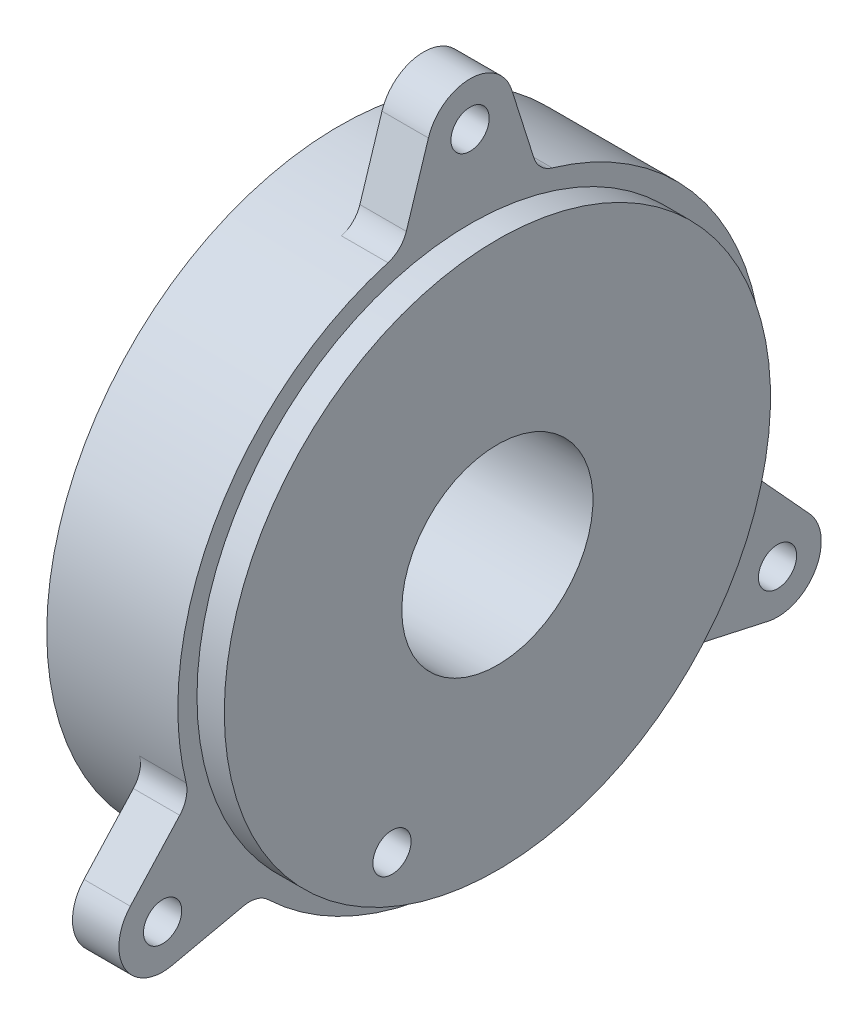
ISO-10303-21;
HEADER;
FILE_DESCRIPTION(('STEP AP214'),'2;1');
FILE_NAME('part.step','',(''),(''),'','','');
FILE_SCHEMA(('AUTOMOTIVE_DESIGN { 1 0 10303 214 1 1 1 1 }'));
ENDSEC;
DATA;
#1=APPLICATION_CONTEXT('core data for automotive mechanical design processes');
#2=APPLICATION_PROTOCOL_DEFINITION('international standard','automotive_design',2000,#1);
#3=PRODUCT_CONTEXT('',#1,'mechanical');
#4=PRODUCT('Part','Part','',(#3));
#5=PRODUCT_RELATED_PRODUCT_CATEGORY('part','',(#4));
#6=PRODUCT_DEFINITION_FORMATION('','',#4);
#7=PRODUCT_DEFINITION_CONTEXT('part definition',#1,'design');
#8=PRODUCT_DEFINITION('design','',#6,#7);
#9=PRODUCT_DEFINITION_SHAPE('','',#8);
#10=(LENGTH_UNIT() NAMED_UNIT(*) SI_UNIT(.MILLI.,.METRE.));
#11=(NAMED_UNIT(*) PLANE_ANGLE_UNIT() SI_UNIT($,.RADIAN.));
#12=(NAMED_UNIT(*) SI_UNIT($,.STERADIAN.) SOLID_ANGLE_UNIT());
#13=UNCERTAINTY_MEASURE_WITH_UNIT(LENGTH_MEASURE(1.E-05),#10,'distance_accuracy_value','');
#14=(GEOMETRIC_REPRESENTATION_CONTEXT(3) GLOBAL_UNCERTAINTY_ASSIGNED_CONTEXT((#13)) GLOBAL_UNIT_ASSIGNED_CONTEXT((#10,
#11,#12)) REPRESENTATION_CONTEXT('',''));
#15=CARTESIAN_POINT('',(0.,0.,0.));
#16=DIRECTION('',(0.,0.,1.));
#17=DIRECTION('',(1.,0.,0.));
#18=AXIS2_PLACEMENT_3D('',#15,#16,#17);
#19=CARTESIAN_POINT('',(0.,53.5,0.));
#20=DIRECTION('',(1.,0.,0.));
#21=DIRECTION('',(0.,0.,-1.));
#22=AXIS2_PLACEMENT_3D('',#19,#20,#21);
#23=PLANE('',#22);
#24=CARTESIAN_POINT('',(0.,0.,0.));
#25=DIRECTION('',(-1.,0.,0.));
#26=DIRECTION('',(0.,0.,1.));
#27=AXIS2_PLACEMENT_3D('',#24,#25,#26);
#28=CIRCLE('',#27,17.5);
#29=CARTESIAN_POINT('',(0.,0.,17.5));
#30=VERTEX_POINT('',#29);
#31=EDGE_CURVE('E270',#30,#30,#28,.T.);
#32=ORIENTED_EDGE('',*,*,#31,.F.);
#33=EDGE_LOOP('',(#32));
#34=FACE_BOUND('',#33,.T.);
#35=CARTESIAN_POINT('',(0.,0.,0.));
#36=DIRECTION('',(-1.,0.,0.));
#37=DIRECTION('',(0.,0.,1.));
#38=AXIS2_PLACEMENT_3D('',#35,#36,#37);
#39=CIRCLE('',#38,22.5);
#40=CARTESIAN_POINT('',(0.,0.,22.5));
#41=VERTEX_POINT('',#40);
#42=EDGE_CURVE('E436',#41,#41,#39,.T.);
#43=ORIENTED_EDGE('',*,*,#42,.T.);
#44=EDGE_LOOP('',(#43));
#45=FACE_BOUND('',#44,.T.);
#46=ADVANCED_FACE('F34',(#34,#45),#23,.F.);
#47=CARTESIAN_POINT('',(0.,0.,0.));
#48=DIRECTION('',(-1.,0.,0.));
#49=DIRECTION('',(0.,0.,1.));
#50=AXIS2_PLACEMENT_3D('',#47,#48,#49);
#51=CYLINDRICAL_SURFACE('',#50,53.5);
#52=CARTESIAN_POINT('',(0.,0.,0.));
#53=DIRECTION('',(-1.,0.,0.));
#54=DIRECTION('',(0.,0.,1.));
#55=AXIS2_PLACEMENT_3D('',#52,#53,#54);
#56=CIRCLE('',#55,53.5);
#57=CARTESIAN_POINT('',(0.,0.,53.5));
#58=VERTEX_POINT('',#57);
#59=EDGE_CURVE('E251',#58,#58,#56,.T.);
#60=ORIENTED_EDGE('',*,*,#59,.F.);
#61=EDGE_LOOP('',(#60));
#62=FACE_BOUND('',#61,.T.);
#63=CARTESIAN_POINT('',(24.,0.,0.));
#64=DIRECTION('',(-1.,0.,0.));
#65=DIRECTION('',(0.,0.,1.));
#66=AXIS2_PLACEMENT_3D('',#63,#64,#65);
#67=CIRCLE('',#66,53.5);
#68=CARTESIAN_POINT('',(24.,-38.6921063220218,-36.9482192854454));
#69=VERTEX_POINT('',#68);
#70=CARTESIAN_POINT('',(24.,-38.6920986751495,36.9482272932342));
#71=VERTEX_POINT('',#70);
#72=EDGE_CURVE('E261',#69,#71,#67,.T.);
#73=ORIENTED_EDGE('',*,*,#72,.T.);
#74=DIRECTION('',(-1.,0.,0.));
#75=VECTOR('',#74,1.);
#76=CARTESIAN_POINT('',(0.,-38.6920986751495,36.9482272932342));
#77=LINE('',#76,#75);
#78=CARTESIAN_POINT('',(15.5,-38.6920986751495,36.9482272932342));
#79=VERTEX_POINT('',#78);
#80=EDGE_CURVE('E320',#71,#79,#77,.T.);
#81=ORIENTED_EDGE('',*,*,#80,.T.);
#82=CARTESIAN_POINT('',(15.5,0.,0.));
#83=DIRECTION('',(1.,0.,0.));
#84=DIRECTION('',(0.,0.866025403784443,0.499999999999992));
#85=AXIS2_PLACEMENT_3D('',#82,#83,#84);
#86=CIRCLE('',#85,53.5);
#87=CARTESIAN_POINT('',(15.5,-12.6520433647827,51.9824566435221));
#88=VERTEX_POINT('',#87);
#89=EDGE_CURVE('E166',#79,#88,#86,.F.);
#90=ORIENTED_EDGE('',*,*,#89,.T.);
#91=DIRECTION('',(-1.,0.,0.));
#92=VECTOR('',#91,1.);
#93=CARTESIAN_POINT('',(0.,-12.6520433647827,51.9824566435221));
#94=LINE('',#93,#92);
#95=CARTESIAN_POINT('',(24.,-12.6520433647827,51.9824566435221));
#96=VERTEX_POINT('',#95);
#97=EDGE_CURVE('E317',#88,#96,#94,.F.);
#98=ORIENTED_EDGE('',*,*,#97,.T.);
#99=CARTESIAN_POINT('',(24.,51.3441527983169,15.0342267317971));
#100=VERTEX_POINT('',#99);
#101=EDGE_CURVE('E256',#96,#100,#67,.T.);
#102=ORIENTED_EDGE('',*,*,#101,.T.);
#103=DIRECTION('',(-1.,0.,0.));
#104=VECTOR('',#103,1.);
#105=CARTESIAN_POINT('',(0.,51.3441527983169,15.0342267317971));
#106=LINE('',#105,#104);
#107=CARTESIAN_POINT('',(15.5,51.3441527983169,15.0342267317971));
#108=VERTEX_POINT('',#107);
#109=EDGE_CURVE('E279',#100,#108,#106,.T.);
#110=ORIENTED_EDGE('',*,*,#109,.T.);
#111=CARTESIAN_POINT('',(15.5,0.,0.));
#112=DIRECTION('',(1.,0.,0.));
#113=DIRECTION('',(0.,0.,-1.));
#114=AXIS2_PLACEMENT_3D('',#111,#112,#113);
#115=CIRCLE('',#114,53.5);
#116=CARTESIAN_POINT('',(15.5,51.3441496868048,-15.0342373580764));
#117=VERTEX_POINT('',#116);
#118=EDGE_CURVE('E228',#108,#117,#115,.F.);
#119=ORIENTED_EDGE('',*,*,#118,.T.);
#120=DIRECTION('',(-1.,0.,0.));
#121=VECTOR('',#120,1.);
#122=CARTESIAN_POINT('',(0.,51.3441496868048,-15.0342373580764));
#123=LINE('',#122,#121);
#124=CARTESIAN_POINT('',(24.,51.3441496868048,-15.0342373580764));
#125=VERTEX_POINT('',#124);
#126=EDGE_CURVE('E276',#117,#125,#123,.F.);
#127=ORIENTED_EDGE('',*,*,#126,.T.);
#128=CARTESIAN_POINT('',(24.,-12.6520541231673,-51.9824540250308));
#129=VERTEX_POINT('',#128);
#130=EDGE_CURVE('E257',#125,#129,#67,.T.);
#131=ORIENTED_EDGE('',*,*,#130,.T.);
#132=DIRECTION('',(-1.,0.,0.));
#133=VECTOR('',#132,1.);
#134=CARTESIAN_POINT('',(0.,-12.6520541231673,-51.9824540250308));
#135=LINE('',#134,#133);
#136=CARTESIAN_POINT('',(15.5,-12.6520541231673,-51.9824540250308));
#137=VERTEX_POINT('',#136);
#138=EDGE_CURVE('E300',#129,#137,#135,.T.);
#139=ORIENTED_EDGE('',*,*,#138,.T.);
#140=CARTESIAN_POINT('',(15.5,0.,0.));
#141=DIRECTION('',(1.,0.,0.));
#142=DIRECTION('',(0.,-0.866025403784436,0.500000000000004));
#143=AXIS2_PLACEMENT_3D('',#140,#141,#142);
#144=CIRCLE('',#143,53.5);
#145=CARTESIAN_POINT('',(15.5,-38.6921063220218,-36.9482192854454));
#146=VERTEX_POINT('',#145);
#147=EDGE_CURVE('E200',#137,#146,#144,.F.);
#148=ORIENTED_EDGE('',*,*,#147,.T.);
#149=DIRECTION('',(-1.,0.,0.));
#150=VECTOR('',#149,1.);
#151=CARTESIAN_POINT('',(0.,-38.6921063220218,-36.9482192854454));
#152=LINE('',#151,#150);
#153=EDGE_CURVE('E297',#146,#69,#152,.F.);
#154=ORIENTED_EDGE('',*,*,#153,.T.);
#155=EDGE_LOOP('',(#73,#81,#90,#98,#102,#110,#119,#127,#131,#139,#148,#154));
#156=FACE_BOUND('',#155,.T.);
#157=ADVANCED_FACE('F343',(#62,#156),#51,.T.);
#158=CARTESIAN_POINT('',(0.,0.,0.));
#159=DIRECTION('',(-1.,0.,0.));
#160=DIRECTION('',(0.,0.,1.));
#161=AXIS2_PLACEMENT_3D('',#158,#159,#160);
#162=CIRCLE('',#161,48.5);
#163=CARTESIAN_POINT('',(0.,0.,48.5));
#164=VERTEX_POINT('',#163);
#165=EDGE_CURVE('E432',#164,#164,#162,.T.);
#166=ORIENTED_EDGE('',*,*,#165,.F.);
#167=EDGE_LOOP('',(#166));
#168=FACE_BOUND('',#167,.T.);
#169=ORIENTED_EDGE('',*,*,#59,.T.);
#170=EDGE_LOOP('',(#169));
#171=FACE_BOUND('',#170,.T.);
#172=ADVANCED_FACE('F411',(#168,#171),#23,.F.);
#173=CARTESIAN_POINT('',(0.,0.,0.));
#174=DIRECTION('',(-1.,0.,0.));
#175=DIRECTION('',(0.,0.,1.));
#176=AXIS2_PLACEMENT_3D('',#173,#174,#175);
#177=CYLINDRICAL_SURFACE('',#176,17.5);
#178=CARTESIAN_POINT('',(29.,0.,0.));
#179=DIRECTION('',(-1.,0.,0.));
#180=DIRECTION('',(0.,0.,1.));
#181=AXIS2_PLACEMENT_3D('',#178,#179,#180);
#182=CIRCLE('',#181,17.5);
#183=CARTESIAN_POINT('',(29.,0.,17.5));
#184=VERTEX_POINT('',#183);
#185=EDGE_CURVE('E267',#184,#184,#182,.T.);
#186=ORIENTED_EDGE('',*,*,#185,.F.);
#187=EDGE_LOOP('',(#186));
#188=FACE_BOUND('',#187,.T.);
#189=ORIENTED_EDGE('',*,*,#31,.T.);
#190=EDGE_LOOP('',(#189));
#191=FACE_BOUND('',#190,.T.);
#192=ADVANCED_FACE('F422',(#188,#191),#177,.F.);
#193=CARTESIAN_POINT('',(29.,17.5,0.));
#194=DIRECTION('',(-1.,0.,0.));
#195=DIRECTION('',(0.,0.,1.));
#196=AXIS2_PLACEMENT_3D('',#193,#194,#195);
#197=PLANE('',#196);
#198=CARTESIAN_POINT('',(29.,-37.500020500125,19.2916394102308));
#199=DIRECTION('',(1.,0.,0.));
#200=DIRECTION('',(0.,0.,-1.));
#201=AXIS2_PLACEMENT_3D('',#198,#199,#200);
#202=CIRCLE('',#201,3.5);
#203=CARTESIAN_POINT('',(29.,-37.500020500125,15.7916394102308));
#204=VERTEX_POINT('',#203);
#205=EDGE_CURVE('E493',#204,#204,#202,.T.);
#206=ORIENTED_EDGE('',*,*,#205,.F.);
#207=EDGE_LOOP('',(#206));
#208=FACE_BOUND('',#207,.T.);
#209=CARTESIAN_POINT('',(29.,0.,0.));
#210=DIRECTION('',(-1.,0.,0.));
#211=DIRECTION('',(0.,0.,1.));
#212=AXIS2_PLACEMENT_3D('',#209,#210,#211);
#213=CIRCLE('',#212,50.);
#214=CARTESIAN_POINT('',(29.,0.,50.));
#215=VERTEX_POINT('',#214);
#216=EDGE_CURVE('E264',#215,#215,#213,.T.);
#217=ORIENTED_EDGE('',*,*,#216,.F.);
#218=EDGE_LOOP('',(#217));
#219=FACE_BOUND('',#218,.T.);
#220=ORIENTED_EDGE('',*,*,#185,.T.);
#221=EDGE_LOOP('',(#220));
#222=FACE_BOUND('',#221,.T.);
#223=ADVANCED_FACE('F427',(#208,#219,#222),#197,.F.);
#224=CARTESIAN_POINT('',(0.,0.,0.));
#225=DIRECTION('',(-1.,0.,0.));
#226=DIRECTION('',(0.,0.,1.));
#227=AXIS2_PLACEMENT_3D('',#224,#225,#226);
#228=CYLINDRICAL_SURFACE('',#227,50.);
#229=CARTESIAN_POINT('',(24.,0.,0.));
#230=DIRECTION('',(-1.,0.,0.));
#231=DIRECTION('',(0.,0.,1.));
#232=AXIS2_PLACEMENT_3D('',#229,#230,#231);
#233=CIRCLE('',#232,50.);
#234=CARTESIAN_POINT('',(24.,0.,50.));
#235=VERTEX_POINT('',#234);
#236=EDGE_CURVE('E260',#235,#235,#233,.T.);
#237=ORIENTED_EDGE('',*,*,#236,.F.);
#238=EDGE_LOOP('',(#237));
#239=FACE_BOUND('',#238,.T.);
#240=ORIENTED_EDGE('',*,*,#216,.T.);
#241=EDGE_LOOP('',(#240));
#242=FACE_BOUND('',#241,.T.);
#243=ADVANCED_FACE('F482',(#239,#242),#228,.T.);
#244=CARTESIAN_POINT('',(24.,50.,0.));
#245=DIRECTION('',(-1.,0.,0.));
#246=DIRECTION('',(0.,0.,1.));
#247=AXIS2_PLACEMENT_3D('',#244,#245,#246);
#248=PLANE('',#247);
#249=ORIENTED_EDGE('',*,*,#130,.F.);
#250=CARTESIAN_POINT('',(24.,56.142668349123,-16.4393062700462));
#251=DIRECTION('',(-1.,0.,0.));
#252=DIRECTION('',(0.,0.,1.));
#253=AXIS2_PLACEMENT_3D('',#250,#251,#252);
#254=CIRCLE('',#253,5.);
#255=CARTESIAN_POINT('',(24.,54.6337956457435,-11.6724096732029));
#256=VERTEX_POINT('',#255);
#257=EDGE_CURVE('E289',#125,#256,#254,.T.);
#258=ORIENTED_EDGE('',*,*,#257,.T.);
#259=DIRECTION('',(0.,0.95337931936866,0.301774540675901));
#260=VECTOR('',#259,1.);
#261=CARTESIAN_POINT('',(24.,-25.4193345788429,-37.01174325471));
#262=LINE('',#261,#260);
#263=CARTESIAN_POINT('',(24.,67.4141963254029,-7.6270108834408));
#264=VERTEX_POINT('',#263);
#265=EDGE_CURVE('E241',#256,#264,#262,.T.);
#266=ORIENTED_EDGE('',*,*,#265,.T.);
#267=CARTESIAN_POINT('',(24.,64.9999999999957,2.3671508478715E-05));
#268=DIRECTION('',(1.,0.,0.));
#269=DIRECTION('',(0.,0.,-1.));
#270=AXIS2_PLACEMENT_3D('',#267,#268,#269);
#271=CIRCLE('',#270,8.00000000000001);
#272=CARTESIAN_POINT('',(24.,67.414164926528,7.62706816511811));
#273=VERTEX_POINT('',#272);
#274=EDGE_CURVE('E243',#264,#273,#271,.T.);
#275=ORIENTED_EDGE('',*,*,#274,.T.);
#276=DIRECTION('',(0.,0.953380561701207,-0.301770615816537));
#277=VECTOR('',#276,1.);
#278=CARTESIAN_POINT('',(24.,42.6797575184133,15.4561740387316));
#279=LINE('',#278,#277);
#280=CARTESIAN_POINT('',(24.,54.633818672348,11.6723918421506));
#281=VERTEX_POINT('',#280);
#282=EDGE_CURVE('E223',#281,#273,#279,.T.);
#283=ORIENTED_EDGE('',*,*,#282,.F.);
#284=CARTESIAN_POINT('',(24.,56.1426717514307,16.4392946506567));
#285=DIRECTION('',(-1.,0.,0.));
#286=DIRECTION('',(0.,0.,1.));
#287=AXIS2_PLACEMENT_3D('',#284,#285,#286);
#288=CIRCLE('',#287,5.);
#289=EDGE_CURVE('E284',#281,#100,#288,.T.);
#290=ORIENTED_EDGE('',*,*,#289,.T.);
#291=ORIENTED_EDGE('',*,*,#101,.F.);
#292=CARTESIAN_POINT('',(24.,-13.8344773241082,56.8406301616083));
#293=DIRECTION('',(-1.,0.,0.));
#294=DIRECTION('',(0.,0.,1.));
#295=AXIS2_PLACEMENT_3D('',#292,#293,#294);
#296=CIRCLE('',#295,5.);
#297=CARTESIAN_POINT('',(24.,-17.2082945224984,53.1504597709831));
#298=VERTEX_POINT('',#297);
#299=EDGE_CURVE('E43',#96,#298,#296,.T.);
#300=ORIENTED_EDGE('',*,*,#299,.T.);
#301=DIRECTION('',(0.,-0.738034078125035,0.674763439678033));
#302=VECTOR('',#301,1.);
#303=CARTESIAN_POINT('',(24.,44.7627771863476,-3.5079178652196));
#304=LINE('',#303,#302);
#305=CARTESIAN_POINT('',(24.,-27.1019129827007,62.1959120352311));
#306=VERTEX_POINT('',#305);
#307=EDGE_CURVE('E189',#298,#306,#304,.T.);
#308=ORIENTED_EDGE('',*,*,#307,.T.);
#309=CARTESIAN_POINT('',(24.,-32.500020500125,56.2916394102308));
#310=DIRECTION('',(1.,0.,0.));
#311=DIRECTION('',(0.,0.866025403784443,0.499999999999992));
#312=AXIS2_PLACEMENT_3D('',#309,#310,#311);
#313=CIRCLE('',#312,8.00000000000001);
#314=CARTESIAN_POINT('',(24.,-40.3123172506513,54.5688453187284));
#315=VERTEX_POINT('',#314);
#316=EDGE_CURVE('E173',#306,#315,#313,.T.);
#317=ORIENTED_EDGE('',*,*,#316,.T.);
#318=DIRECTION('',(0.,-0.2153492614378,0.976537093815793));
#319=VECTOR('',#318,1.);
#320=CARTESIAN_POINT('',(24.,-34.7253181220615,29.2336672189403));
#321=LINE('',#320,#319);
#322=CARTESIAN_POINT('',(24.,-37.4254971944023,41.478078954931));
#323=VERTEX_POINT('',#322);
#324=EDGE_CURVE('E187',#323,#315,#321,.T.);
#325=ORIENTED_EDGE('',*,*,#324,.F.);
#326=CARTESIAN_POINT('',(24.,-42.3081826634812,40.401332647742));
#327=DIRECTION('',(-1.,0.,0.));
#328=DIRECTION('',(0.,0.,1.));
#329=AXIS2_PLACEMENT_3D('',#326,#327,#328);
#330=CIRCLE('',#329,5.);
#331=EDGE_CURVE('E324',#323,#71,#330,.T.);
#332=ORIENTED_EDGE('',*,*,#331,.T.);
#333=ORIENTED_EDGE('',*,*,#72,.F.);
#334=CARTESIAN_POINT('',(24.,-42.3081910250145,-40.4013238915618));
#335=DIRECTION('',(-1.,0.,0.));
#336=DIRECTION('',(0.,0.,1.));
#337=AXIS2_PLACEMENT_3D('',#334,#335,#336);
#338=CIRCLE('',#337,5.);
#339=CARTESIAN_POINT('',(24.,-37.4255011232449,-41.4780500977799));
#340=VERTEX_POINT('',#339);
#341=EDGE_CURVE('E309',#69,#340,#338,.T.);
#342=ORIENTED_EDGE('',*,*,#341,.T.);
#343=DIRECTION('',(0.,-0.215345241243624,-0.976537980353927));
#344=VECTOR('',#343,1.);
#345=CARTESIAN_POINT('',(24.,-19.3434426075045,40.5196611199293));
#346=LINE('',#345,#344);
#347=CARTESIAN_POINT('',(24.,-40.3122833427018,-54.5689011517899));
#348=VERTEX_POINT('',#347);
#349=EDGE_CURVE('E213',#340,#348,#346,.T.);
#350=ORIENTED_EDGE('',*,*,#349,.T.);
#351=CARTESIAN_POINT('',(24.,-32.4999794998704,-56.2916630817389));
#352=DIRECTION('',(1.,0.,0.));
#353=DIRECTION('',(0.,-0.866025403784436,0.500000000000004));
#354=AXIS2_PLACEMENT_3D('',#351,#352,#353);
#355=CIRCLE('',#354,8.00000000000001);
#356=CARTESIAN_POINT('',(24.,-27.1018476758764,-62.1959134838461));
#357=VERTEX_POINT('',#356);
#358=EDGE_CURVE('E215',#348,#357,#355,.T.);
#359=ORIENTED_EDGE('',*,*,#358,.T.);
#360=DIRECTION('',(0.,-0.738031300263401,-0.674766477999251));
#361=VECTOR('',#360,1.);
#362=CARTESIAN_POINT('',(24.,-7.95443939635173,-44.6898412576716));
#363=LINE('',#362,#361);
#364=CARTESIAN_POINT('',(24.,-17.2083214779456,-53.1504707970812));
#365=VERTEX_POINT('',#364);
#366=EDGE_CURVE('E196',#365,#357,#363,.T.);
#367=ORIENTED_EDGE('',*,*,#366,.F.);
#368=CARTESIAN_POINT('',(24.,-13.8344890879493,-56.8406272983982));
#369=DIRECTION('',(-1.,0.,0.));
#370=DIRECTION('',(0.,0.,1.));
#371=AXIS2_PLACEMENT_3D('',#368,#369,#370);
#372=CIRCLE('',#371,5.);
#373=EDGE_CURVE('E305',#365,#129,#372,.T.);
#374=ORIENTED_EDGE('',*,*,#373,.T.);
#375=EDGE_LOOP('',(#249,#258,#266,#275,#283,#290,#291,#300,#308,#317,#325,#332,#333,#342,#350,
#359,#367,#374));
#376=FACE_BOUND('',#375,.T.);
#377=ORIENTED_EDGE('',*,*,#236,.T.);
#378=EDGE_LOOP('',(#377));
#379=FACE_BOUND('',#378,.T.);
#380=CARTESIAN_POINT('',(24.,64.9999999999957,2.3671508478715E-05));
#381=DIRECTION('',(1.,0.,0.));
#382=DIRECTION('',(0.,0.,-1.));
#383=AXIS2_PLACEMENT_3D('',#380,#381,#382);
#384=CIRCLE('',#383,3.5);
#385=CARTESIAN_POINT('',(24.,64.9999999999957,-3.49997632849152));
#386=VERTEX_POINT('',#385);
#387=EDGE_CURVE('E229',#386,#386,#384,.T.);
#388=ORIENTED_EDGE('',*,*,#387,.F.);
#389=EDGE_LOOP('',(#388));
#390=FACE_BOUND('',#389,.T.);
#391=CARTESIAN_POINT('',(24.,-32.4999794998704,-56.2916630817389));
#392=DIRECTION('',(1.,0.,0.));
#393=DIRECTION('',(0.,-0.866025403784436,0.500000000000004));
#394=AXIS2_PLACEMENT_3D('',#391,#392,#393);
#395=CIRCLE('',#394,3.5);
#396=CARTESIAN_POINT('',(24.,-35.531068413116,-54.5416630817389));
#397=VERTEX_POINT('',#396);
#398=EDGE_CURVE('E201',#397,#397,#395,.T.);
#399=ORIENTED_EDGE('',*,*,#398,.F.);
#400=EDGE_LOOP('',(#399));
#401=FACE_BOUND('',#400,.T.);
#402=CARTESIAN_POINT('',(24.,-32.500020500125,56.2916394102308));
#403=DIRECTION('',(1.,0.,0.));
#404=DIRECTION('',(0.,0.866025403784443,0.499999999999992));
#405=AXIS2_PLACEMENT_3D('',#402,#403,#404);
#406=CIRCLE('',#405,3.5);
#407=CARTESIAN_POINT('',(24.,-29.4689315868795,58.0416394102308));
#408=VERTEX_POINT('',#407);
#409=EDGE_CURVE('E193',#408,#408,#406,.T.);
#410=ORIENTED_EDGE('',*,*,#409,.F.);
#411=EDGE_LOOP('',(#410));
#412=FACE_BOUND('',#411,.T.);
#413=ADVANCED_FACE('F340',(#376,#379,#390,#401,#412),#248,.F.);
#414=CARTESIAN_POINT('',(15.5,42.6797575184133,15.4561740387316));
#415=DIRECTION('',(0.,-0.301770615816537,-0.953380561701207));
#416=DIRECTION('',(0.,0.953380561701207,-0.301770615816537));
#417=AXIS2_PLACEMENT_3D('',#414,#415,#416);
#418=PLANE('',#417);
#419=DIRECTION('',(0.,0.953380561701207,-0.301770615816537));
#420=VECTOR('',#419,1.);
#421=CARTESIAN_POINT('',(15.5,42.6797575184133,15.4561740387316));
#422=LINE('',#421,#420);
#423=CARTESIAN_POINT('',(15.5,54.633818672348,11.6723918421506));
#424=VERTEX_POINT('',#423);
#425=CARTESIAN_POINT('',(15.5,67.414164926528,7.62706816511811));
#426=VERTEX_POINT('',#425);
#427=EDGE_CURVE('E226',#424,#426,#422,.T.);
#428=ORIENTED_EDGE('',*,*,#427,.F.);
#429=DIRECTION('',(1.,0.,0.));
#430=VECTOR('',#429,1.);
#431=CARTESIAN_POINT('',(24.,54.633818672348,11.6723918421506));
#432=LINE('',#431,#430);
#433=EDGE_CURVE('E273',#424,#281,#432,.T.);
#434=ORIENTED_EDGE('',*,*,#433,.T.);
#435=ORIENTED_EDGE('',*,*,#282,.T.);
#436=DIRECTION('',(1.,0.,0.));
#437=VECTOR('',#436,1.);
#438=CARTESIAN_POINT('',(15.5,67.414164926528,7.62706816511811));
#439=LINE('',#438,#437);
#440=EDGE_CURVE('E248',#426,#273,#439,.T.);
#441=ORIENTED_EDGE('',*,*,#440,.F.);
#442=EDGE_LOOP('',(#428,#434,#435,#441));
#443=FACE_BOUND('',#442,.T.);
#444=ADVANCED_FACE('F359',(#443),#418,.F.);
#445=CARTESIAN_POINT('',(15.5,64.9999999999957,2.3671508478715E-05));
#446=DIRECTION('',(1.,0.,0.));
#447=DIRECTION('',(0.,0.,-1.));
#448=AXIS2_PLACEMENT_3D('',#445,#446,#447);
#449=CYLINDRICAL_SURFACE('',#448,8.00000000000001);
#450=ORIENTED_EDGE('',*,*,#274,.F.);
#451=DIRECTION('',(1.,0.,0.));
#452=VECTOR('',#451,1.);
#453=CARTESIAN_POINT('',(15.5,67.4141963254029,-7.6270108834408));
#454=LINE('',#453,#452);
#455=CARTESIAN_POINT('',(15.5,67.4141963254029,-7.6270108834408));
#456=VERTEX_POINT('',#455);
#457=EDGE_CURVE('E239',#456,#264,#454,.T.);
#458=ORIENTED_EDGE('',*,*,#457,.F.);
#459=CARTESIAN_POINT('',(15.5,64.9999999999957,2.3671508478715E-05));
#460=DIRECTION('',(1.,0.,0.));
#461=DIRECTION('',(0.,0.,-1.));
#462=AXIS2_PLACEMENT_3D('',#459,#460,#461);
#463=CIRCLE('',#462,8.00000000000001);
#464=EDGE_CURVE('E233',#456,#426,#463,.T.);
#465=ORIENTED_EDGE('',*,*,#464,.T.);
#466=ORIENTED_EDGE('',*,*,#440,.T.);
#467=EDGE_LOOP('',(#450,#458,#465,#466));
#468=FACE_BOUND('',#467,.T.);
#469=ADVANCED_FACE('F363',(#468),#449,.T.);
#470=CARTESIAN_POINT('',(15.5,-25.4193345788429,-37.01174325471));
#471=DIRECTION('',(0.,0.301774540675901,-0.95337931936866));
#472=DIRECTION('',(0.,0.95337931936866,0.301774540675901));
#473=AXIS2_PLACEMENT_3D('',#470,#471,#472);
#474=PLANE('',#473);
#475=ORIENTED_EDGE('',*,*,#265,.F.);
#476=DIRECTION('',(-1.,0.,0.));
#477=VECTOR('',#476,1.);
#478=CARTESIAN_POINT('',(15.5,54.6337956457435,-11.6724096732029));
#479=LINE('',#478,#477);
#480=CARTESIAN_POINT('',(15.5,54.6337956457435,-11.6724096732029));
#481=VERTEX_POINT('',#480);
#482=EDGE_CURVE('E282',#256,#481,#479,.T.);
#483=ORIENTED_EDGE('',*,*,#482,.T.);
#484=DIRECTION('',(0.,0.95337931936866,0.301774540675901));
#485=VECTOR('',#484,1.);
#486=CARTESIAN_POINT('',(15.5,-25.4193345788429,-37.01174325471));
#487=LINE('',#486,#485);
#488=EDGE_CURVE('E231',#481,#456,#487,.T.);
#489=ORIENTED_EDGE('',*,*,#488,.T.);
#490=ORIENTED_EDGE('',*,*,#457,.T.);
#491=EDGE_LOOP('',(#475,#483,#489,#490));
#492=FACE_BOUND('',#491,.T.);
#493=ADVANCED_FACE('F470',(#492),#474,.T.);
#494=CARTESIAN_POINT('',(15.5,64.9999999999957,2.3671508478715E-05));
#495=DIRECTION('',(1.,0.,0.));
#496=DIRECTION('',(0.,0.,-1.));
#497=AXIS2_PLACEMENT_3D('',#494,#495,#496);
#498=CYLINDRICAL_SURFACE('',#497,3.5);
#499=CARTESIAN_POINT('',(15.5,64.9999999999957,2.3671508478715E-05));
#500=DIRECTION('',(1.,0.,0.));
#501=DIRECTION('',(0.,0.,-1.));
#502=AXIS2_PLACEMENT_3D('',#499,#500,#501);
#503=CIRCLE('',#502,3.5);
#504=CARTESIAN_POINT('',(15.5,64.9999999999957,-3.49997632849152));
#505=VERTEX_POINT('',#504);
#506=EDGE_CURVE('E236',#505,#505,#503,.T.);
#507=ORIENTED_EDGE('',*,*,#506,.F.);
#508=EDGE_LOOP('',(#507));
#509=FACE_BOUND('',#508,.T.);
#510=ORIENTED_EDGE('',*,*,#387,.T.);
#511=EDGE_LOOP('',(#510));
#512=FACE_BOUND('',#511,.T.);
#513=ADVANCED_FACE('F465',(#509,#512),#498,.F.);
#514=CARTESIAN_POINT('',(15.5,0.326641456012079,-118.34955609212));
#515=DIRECTION('',(1.,0.,0.));
#516=DIRECTION('',(0.,0.,-1.));
#517=AXIS2_PLACEMENT_3D('',#514,#515,#516);
#518=PLANE('',#517);
#519=ORIENTED_EDGE('',*,*,#118,.F.);
#520=CARTESIAN_POINT('',(15.5,56.1426717514307,16.4392946506567));
#521=DIRECTION('',(1.,0.,0.));
#522=DIRECTION('',(0.,0.,-1.));
#523=AXIS2_PLACEMENT_3D('',#520,#521,#522);
#524=CIRCLE('',#523,5.);
#525=EDGE_CURVE('E287',#108,#424,#524,.T.);
#526=ORIENTED_EDGE('',*,*,#525,.T.);
#527=ORIENTED_EDGE('',*,*,#427,.T.);
#528=ORIENTED_EDGE('',*,*,#464,.F.);
#529=ORIENTED_EDGE('',*,*,#488,.F.);
#530=CARTESIAN_POINT('',(15.5,56.142668349123,-16.4393062700462));
#531=DIRECTION('',(1.,0.,0.));
#532=DIRECTION('',(0.,0.,-1.));
#533=AXIS2_PLACEMENT_3D('',#530,#531,#532);
#534=CIRCLE('',#533,5.);
#535=EDGE_CURVE('E291',#481,#117,#534,.T.);
#536=ORIENTED_EDGE('',*,*,#535,.T.);
#537=EDGE_LOOP('',(#519,#526,#527,#528,#529,#536));
#538=FACE_BOUND('',#537,.T.);
#539=ORIENTED_EDGE('',*,*,#506,.T.);
#540=EDGE_LOOP('',(#539));
#541=FACE_BOUND('',#540,.T.);
#542=ADVANCED_FACE('F354',(#538,#541),#518,.F.);
#543=CARTESIAN_POINT('',(0.,56.1426717514307,16.4392946506567));
#544=DIRECTION('',(-1.,0.,0.));
#545=DIRECTION('',(0.,0.,1.));
#546=AXIS2_PLACEMENT_3D('',#543,#544,#545);
#547=CYLINDRICAL_SURFACE('',#546,5.);
#548=ORIENTED_EDGE('',*,*,#525,.F.);
#549=ORIENTED_EDGE('',*,*,#109,.F.);
#550=ORIENTED_EDGE('',*,*,#289,.F.);
#551=ORIENTED_EDGE('',*,*,#433,.F.);
#552=EDGE_LOOP('',(#548,#549,#550,#551));
#553=FACE_BOUND('',#552,.T.);
#554=ADVANCED_FACE('F351',(#553),#547,.F.);
#555=CARTESIAN_POINT('',(0.,56.142668349123,-16.4393062700462));
#556=DIRECTION('',(-1.,0.,0.));
#557=DIRECTION('',(0.,0.,1.));
#558=AXIS2_PLACEMENT_3D('',#555,#556,#557);
#559=CYLINDRICAL_SURFACE('',#558,5.);
#560=ORIENTED_EDGE('',*,*,#535,.F.);
#561=ORIENTED_EDGE('',*,*,#482,.F.);
#562=ORIENTED_EDGE('',*,*,#257,.F.);
#563=ORIENTED_EDGE('',*,*,#126,.F.);
#564=EDGE_LOOP('',(#560,#561,#562,#563));
#565=FACE_BOUND('',#564,.T.);
#566=ADVANCED_FACE('F370',(#565),#559,.F.);
#567=CARTESIAN_POINT('',(15.5,-7.95443939635173,-44.6898412576716));
#568=DIRECTION('',(0.,-0.674766477999251,0.738031300263401));
#569=DIRECTION('',(0.,-0.738031300263401,-0.674766477999251));
#570=AXIS2_PLACEMENT_3D('',#567,#568,#569);
#571=PLANE('',#570);
#572=DIRECTION('',(0.,-0.738031300263401,-0.674766477999251));
#573=VECTOR('',#572,1.);
#574=CARTESIAN_POINT('',(15.5,-7.95443939635173,-44.6898412576716));
#575=LINE('',#574,#573);
#576=CARTESIAN_POINT('',(15.5,-17.2083214779456,-53.1504707970812));
#577=VERTEX_POINT('',#576);
#578=CARTESIAN_POINT('',(15.5,-27.1018476758764,-62.1959134838461));
#579=VERTEX_POINT('',#578);
#580=EDGE_CURVE('E198',#577,#579,#575,.T.);
#581=ORIENTED_EDGE('',*,*,#580,.F.);
#582=DIRECTION('',(1.,0.,0.));
#583=VECTOR('',#582,1.);
#584=CARTESIAN_POINT('',(24.,-17.2083214779456,-53.1504707970812));
#585=LINE('',#584,#583);
#586=EDGE_CURVE('E294',#577,#365,#585,.T.);
#587=ORIENTED_EDGE('',*,*,#586,.T.);
#588=ORIENTED_EDGE('',*,*,#366,.T.);
#589=DIRECTION('',(1.,0.,0.));
#590=VECTOR('',#589,1.);
#591=CARTESIAN_POINT('',(15.5,-27.1018476758764,-62.1959134838461));
#592=LINE('',#591,#590);
#593=EDGE_CURVE('E220',#579,#357,#592,.T.);
#594=ORIENTED_EDGE('',*,*,#593,.F.);
#595=EDGE_LOOP('',(#581,#587,#588,#594));
#596=FACE_BOUND('',#595,.T.);
#597=ADVANCED_FACE('F380',(#596),#571,.F.);
#598=CARTESIAN_POINT('',(15.5,-32.4999794998704,-56.2916630817389));
#599=DIRECTION('',(1.,0.,0.));
#600=DIRECTION('',(0.,0.,-1.));
#601=AXIS2_PLACEMENT_3D('',#598,#599,#600);
#602=CYLINDRICAL_SURFACE('',#601,8.00000000000001);
#603=ORIENTED_EDGE('',*,*,#358,.F.);
#604=DIRECTION('',(1.,0.,0.));
#605=VECTOR('',#604,1.);
#606=CARTESIAN_POINT('',(15.5,-40.3122833427018,-54.5689011517899));
#607=LINE('',#606,#605);
#608=CARTESIAN_POINT('',(15.5,-40.3122833427018,-54.5689011517899));
#609=VERTEX_POINT('',#608);
#610=EDGE_CURVE('E211',#609,#348,#607,.T.);
#611=ORIENTED_EDGE('',*,*,#610,.F.);
#612=CARTESIAN_POINT('',(15.5,-32.4999794998704,-56.2916630817389));
#613=DIRECTION('',(1.,0.,0.));
#614=DIRECTION('',(0.,-0.866025403784436,0.500000000000004));
#615=AXIS2_PLACEMENT_3D('',#612,#613,#614);
#616=CIRCLE('',#615,8.00000000000001);
#617=EDGE_CURVE('E205',#609,#579,#616,.T.);
#618=ORIENTED_EDGE('',*,*,#617,.T.);
#619=ORIENTED_EDGE('',*,*,#593,.T.);
#620=EDGE_LOOP('',(#603,#611,#618,#619));
#621=FACE_BOUND('',#620,.T.);
#622=ADVANCED_FACE('F397',(#621),#602,.T.);
#623=CARTESIAN_POINT('',(15.5,-19.3434426075045,40.5196611199293));
#624=DIRECTION('',(0.,-0.976537980353926,0.215345241243624));
#625=DIRECTION('',(0.,-0.215345241243624,-0.976537980353927));
#626=AXIS2_PLACEMENT_3D('',#623,#624,#625);
#627=PLANE('',#626);
#628=ORIENTED_EDGE('',*,*,#349,.F.);
#629=DIRECTION('',(-1.,0.,0.));
#630=VECTOR('',#629,1.);
#631=CARTESIAN_POINT('',(15.5,-37.4255011232449,-41.4780500977799));
#632=LINE('',#631,#630);
#633=CARTESIAN_POINT('',(15.5,-37.4255011232449,-41.4780500977799));
#634=VERTEX_POINT('',#633);
#635=EDGE_CURVE('E303',#340,#634,#632,.T.);
#636=ORIENTED_EDGE('',*,*,#635,.T.);
#637=DIRECTION('',(0.,-0.215345241243624,-0.976537980353927));
#638=VECTOR('',#637,1.);
#639=CARTESIAN_POINT('',(15.5,-19.3434426075045,40.5196611199293));
#640=LINE('',#639,#638);
#641=EDGE_CURVE('E203',#634,#609,#640,.T.);
#642=ORIENTED_EDGE('',*,*,#641,.T.);
#643=ORIENTED_EDGE('',*,*,#610,.T.);
#644=EDGE_LOOP('',(#628,#636,#642,#643));
#645=FACE_BOUND('',#644,.T.);
#646=ADVANCED_FACE('F393',(#645),#627,.T.);
#647=CARTESIAN_POINT('',(15.5,-32.4999794998704,-56.2916630817389));
#648=DIRECTION('',(1.,0.,0.));
#649=DIRECTION('',(0.,0.,-1.));
#650=AXIS2_PLACEMENT_3D('',#647,#648,#649);
#651=CYLINDRICAL_SURFACE('',#650,3.5);
#652=CARTESIAN_POINT('',(15.5,-32.4999794998704,-56.2916630817389));
#653=DIRECTION('',(1.,0.,0.));
#654=DIRECTION('',(0.,-0.866025403784436,0.500000000000004));
#655=AXIS2_PLACEMENT_3D('',#652,#653,#654);
#656=CIRCLE('',#655,3.5);
#657=CARTESIAN_POINT('',(15.5,-35.531068413116,-54.5416630817389));
#658=VERTEX_POINT('',#657);
#659=EDGE_CURVE('E208',#658,#658,#656,.T.);
#660=ORIENTED_EDGE('',*,*,#659,.F.);
#661=EDGE_LOOP('',(#660));
#662=FACE_BOUND('',#661,.T.);
#663=ORIENTED_EDGE('',*,*,#398,.T.);
#664=EDGE_LOOP('',(#663));
#665=FACE_BOUND('',#664,.T.);
#666=ADVANCED_FACE('F404',(#662,#665),#651,.F.);
#667=CARTESIAN_POINT('',(15.5,-102.657042830393,58.891898247225));
#668=DIRECTION('',(1.,0.,0.));
#669=DIRECTION('',(0.,-0.866025403784436,0.500000000000004));
#670=AXIS2_PLACEMENT_3D('',#667,#668,#669);
#671=PLANE('',#670);
#672=ORIENTED_EDGE('',*,*,#147,.F.);
#673=CARTESIAN_POINT('',(15.5,-13.8344890879493,-56.8406272983982));
#674=DIRECTION('',(1.,0.,0.));
#675=DIRECTION('',(0.,0.,-1.));
#676=AXIS2_PLACEMENT_3D('',#673,#674,#675);
#677=CIRCLE('',#676,5.);
#678=EDGE_CURVE('E307',#137,#577,#677,.T.);
#679=ORIENTED_EDGE('',*,*,#678,.T.);
#680=ORIENTED_EDGE('',*,*,#580,.T.);
#681=ORIENTED_EDGE('',*,*,#617,.F.);
#682=ORIENTED_EDGE('',*,*,#641,.F.);
#683=CARTESIAN_POINT('',(15.5,-42.3081910250145,-40.4013238915618));
#684=DIRECTION('',(1.,0.,0.));
#685=DIRECTION('',(0.,0.,-1.));
#686=AXIS2_PLACEMENT_3D('',#683,#684,#685);
#687=CIRCLE('',#686,5.);
#688=EDGE_CURVE('E311',#634,#146,#687,.T.);
#689=ORIENTED_EDGE('',*,*,#688,.T.);
#690=EDGE_LOOP('',(#672,#679,#680,#681,#682,#689));
#691=FACE_BOUND('',#690,.T.);
#692=ORIENTED_EDGE('',*,*,#659,.T.);
#693=EDGE_LOOP('',(#692));
#694=FACE_BOUND('',#693,.T.);
#695=ADVANCED_FACE('F384',(#691,#694),#671,.F.);
#696=CARTESIAN_POINT('',(15.5,-34.7253181220615,29.2336672189403));
#697=DIRECTION('',(0.,0.976537093815793,0.2153492614378));
#698=DIRECTION('',(0.,-0.2153492614378,0.976537093815793));
#699=AXIS2_PLACEMENT_3D('',#696,#697,#698);
#700=PLANE('',#699);
#701=DIRECTION('',(0.,-0.2153492614378,0.976537093815793));
#702=VECTOR('',#701,1.);
#703=CARTESIAN_POINT('',(15.5,-34.7253181220615,29.2336672189403));
#704=LINE('',#703,#702);
#705=CARTESIAN_POINT('',(15.5,-37.4254971944023,41.478078954931));
#706=VERTEX_POINT('',#705);
#707=CARTESIAN_POINT('',(15.5,-40.3123172506513,54.5688453187284));
#708=VERTEX_POINT('',#707);
#709=EDGE_CURVE('E180',#706,#708,#704,.T.);
#710=ORIENTED_EDGE('',*,*,#709,.F.);
#711=DIRECTION('',(1.,0.,0.));
#712=VECTOR('',#711,1.);
#713=CARTESIAN_POINT('',(24.,-37.4254971944023,41.478078954931));
#714=LINE('',#713,#712);
#715=EDGE_CURVE('E314',#706,#323,#714,.T.);
#716=ORIENTED_EDGE('',*,*,#715,.T.);
#717=ORIENTED_EDGE('',*,*,#324,.T.);
#718=DIRECTION('',(1.,0.,0.));
#719=VECTOR('',#718,1.);
#720=CARTESIAN_POINT('',(15.5,-40.3123172506513,54.5688453187284));
#721=LINE('',#720,#719);
#722=EDGE_CURVE('E174',#708,#315,#721,.T.);
#723=ORIENTED_EDGE('',*,*,#722,.F.);
#724=EDGE_LOOP('',(#710,#716,#717,#723));
#725=FACE_BOUND('',#724,.T.);
#726=ADVANCED_FACE('F333',(#725),#700,.F.);
#727=CARTESIAN_POINT('',(15.5,-32.500020500125,56.2916394102308));
#728=DIRECTION('',(1.,0.,0.));
#729=DIRECTION('',(0.,0.,-1.));
#730=AXIS2_PLACEMENT_3D('',#727,#728,#729);
#731=CYLINDRICAL_SURFACE('',#730,8.00000000000001);
#732=ORIENTED_EDGE('',*,*,#316,.F.);
#733=DIRECTION('',(1.,0.,0.));
#734=VECTOR('',#733,1.);
#735=CARTESIAN_POINT('',(15.5,-27.1019129827007,62.1959120352311));
#736=LINE('',#735,#734);
#737=CARTESIAN_POINT('',(15.5,-27.1019129827007,62.1959120352311));
#738=VERTEX_POINT('',#737);
#739=EDGE_CURVE('E160',#738,#306,#736,.T.);
#740=ORIENTED_EDGE('',*,*,#739,.F.);
#741=CARTESIAN_POINT('',(15.5,-32.500020500125,56.2916394102308));
#742=DIRECTION('',(1.,0.,0.));
#743=DIRECTION('',(0.,0.866025403784443,0.499999999999992));
#744=AXIS2_PLACEMENT_3D('',#741,#742,#743);
#745=CIRCLE('',#744,8.00000000000001);
#746=EDGE_CURVE('E165',#738,#708,#745,.T.);
#747=ORIENTED_EDGE('',*,*,#746,.T.);
#748=ORIENTED_EDGE('',*,*,#722,.T.);
#749=EDGE_LOOP('',(#732,#740,#747,#748));
#750=FACE_BOUND('',#749,.T.);
#751=ADVANCED_FACE('F170',(#750),#731,.T.);
#752=CARTESIAN_POINT('',(15.5,44.7627771863476,-3.5079178652196));
#753=DIRECTION('',(0.,0.674763439678033,0.738034078125034));
#754=DIRECTION('',(0.,-0.738034078125034,0.674763439678033));
#755=AXIS2_PLACEMENT_3D('',#752,#753,#754);
#756=PLANE('',#755);
#757=ORIENTED_EDGE('',*,*,#307,.F.);
#758=DIRECTION('',(-1.,0.,0.));
#759=VECTOR('',#758,1.);
#760=CARTESIAN_POINT('',(15.5,-17.2082945224984,53.1504597709831));
#761=LINE('',#760,#759);
#762=CARTESIAN_POINT('',(15.5,-17.2082945224984,53.1504597709831));
#763=VERTEX_POINT('',#762);
#764=EDGE_CURVE('E50',#298,#763,#761,.T.);
#765=ORIENTED_EDGE('',*,*,#764,.T.);
#766=DIRECTION('',(0.,-0.738034078125035,0.674763439678033));
#767=VECTOR('',#766,1.);
#768=CARTESIAN_POINT('',(15.5,44.7627771863476,-3.5079178652196));
#769=LINE('',#768,#767);
#770=EDGE_CURVE('E157',#763,#738,#769,.T.);
#771=ORIENTED_EDGE('',*,*,#770,.T.);
#772=ORIENTED_EDGE('',*,*,#739,.T.);
#773=EDGE_LOOP('',(#757,#765,#771,#772));
#774=FACE_BOUND('',#773,.T.);
#775=ADVANCED_FACE('F159',(#774),#756,.T.);
#776=CARTESIAN_POINT('',(15.5,-32.500020500125,56.2916394102308));
#777=DIRECTION('',(1.,0.,0.));
#778=DIRECTION('',(0.,0.,-1.));
#779=AXIS2_PLACEMENT_3D('',#776,#777,#778);
#780=CYLINDRICAL_SURFACE('',#779,3.5);
#781=CARTESIAN_POINT('',(15.5,-32.500020500125,56.2916394102308));
#782=DIRECTION('',(1.,0.,0.));
#783=DIRECTION('',(0.,0.866025403784443,0.499999999999992));
#784=AXIS2_PLACEMENT_3D('',#781,#782,#783);
#785=CIRCLE('',#784,3.5);
#786=CARTESIAN_POINT('',(15.5,-29.4689315868795,58.0416394102308));
#787=VERTEX_POINT('',#786);
#788=EDGE_CURVE('E175',#787,#787,#785,.T.);
#789=ORIENTED_EDGE('',*,*,#788,.F.);
#790=EDGE_LOOP('',(#789));
#791=FACE_BOUND('',#790,.T.);
#792=ORIENTED_EDGE('',*,*,#409,.T.);
#793=EDGE_LOOP('',(#792));
#794=FACE_BOUND('',#793,.T.);
#795=ADVANCED_FACE('F523',(#791,#794),#780,.F.);
#796=CARTESIAN_POINT('',(15.5,102.330401374382,59.4576578448947));
#797=DIRECTION('',(1.,0.,0.));
#798=DIRECTION('',(0.,0.866025403784443,0.499999999999992));
#799=AXIS2_PLACEMENT_3D('',#796,#797,#798);
#800=PLANE('',#799);
#801=ORIENTED_EDGE('',*,*,#89,.F.);
#802=CARTESIAN_POINT('',(15.5,-42.3081826634812,40.401332647742));
#803=DIRECTION('',(1.,0.,0.));
#804=DIRECTION('',(0.,0.,-1.));
#805=AXIS2_PLACEMENT_3D('',#802,#803,#804);
#806=CIRCLE('',#805,5.);
#807=EDGE_CURVE('E326',#79,#706,#806,.T.);
#808=ORIENTED_EDGE('',*,*,#807,.T.);
#809=ORIENTED_EDGE('',*,*,#709,.T.);
#810=ORIENTED_EDGE('',*,*,#746,.F.);
#811=ORIENTED_EDGE('',*,*,#770,.F.);
#812=CARTESIAN_POINT('',(15.5,-13.8344773241082,56.8406301616083));
#813=DIRECTION('',(1.,0.,0.));
#814=DIRECTION('',(0.,0.,-1.));
#815=AXIS2_PLACEMENT_3D('',#812,#813,#814);
#816=CIRCLE('',#815,5.);
#817=EDGE_CURVE('E12',#763,#88,#816,.T.);
#818=ORIENTED_EDGE('',*,*,#817,.T.);
#819=EDGE_LOOP('',(#801,#808,#809,#810,#811,#818));
#820=FACE_BOUND('',#819,.T.);
#821=ORIENTED_EDGE('',*,*,#788,.T.);
#822=EDGE_LOOP('',(#821));
#823=FACE_BOUND('',#822,.T.);
#824=ADVANCED_FACE('F177',(#820,#823),#800,.F.);
#825=CARTESIAN_POINT('',(0.,-13.8344890879493,-56.8406272983982));
#826=DIRECTION('',(-1.,0.,0.));
#827=DIRECTION('',(0.,0.,1.));
#828=AXIS2_PLACEMENT_3D('',#825,#826,#827);
#829=CYLINDRICAL_SURFACE('',#828,5.);
#830=ORIENTED_EDGE('',*,*,#678,.F.);
#831=ORIENTED_EDGE('',*,*,#138,.F.);
#832=ORIENTED_EDGE('',*,*,#373,.F.);
#833=ORIENTED_EDGE('',*,*,#586,.F.);
#834=EDGE_LOOP('',(#830,#831,#832,#833));
#835=FACE_BOUND('',#834,.T.);
#836=ADVANCED_FACE('F377',(#835),#829,.F.);
#837=CARTESIAN_POINT('',(0.,-42.3081910250145,-40.4013238915618));
#838=DIRECTION('',(-1.,0.,0.));
#839=DIRECTION('',(0.,0.,1.));
#840=AXIS2_PLACEMENT_3D('',#837,#838,#839);
#841=CYLINDRICAL_SURFACE('',#840,5.);
#842=ORIENTED_EDGE('',*,*,#688,.F.);
#843=ORIENTED_EDGE('',*,*,#635,.F.);
#844=ORIENTED_EDGE('',*,*,#341,.F.);
#845=ORIENTED_EDGE('',*,*,#153,.F.);
#846=EDGE_LOOP('',(#842,#843,#844,#845));
#847=FACE_BOUND('',#846,.T.);
#848=ADVANCED_FACE('F390',(#847),#841,.F.);
#849=CARTESIAN_POINT('',(0.,-42.3081826634812,40.401332647742));
#850=DIRECTION('',(-1.,0.,0.));
#851=DIRECTION('',(0.,0.,1.));
#852=AXIS2_PLACEMENT_3D('',#849,#850,#851);
#853=CYLINDRICAL_SURFACE('',#852,5.);
#854=ORIENTED_EDGE('',*,*,#807,.F.);
#855=ORIENTED_EDGE('',*,*,#80,.F.);
#856=ORIENTED_EDGE('',*,*,#331,.F.);
#857=ORIENTED_EDGE('',*,*,#715,.F.);
#858=EDGE_LOOP('',(#854,#855,#856,#857));
#859=FACE_BOUND('',#858,.T.);
#860=ADVANCED_FACE('F336',(#859),#853,.F.);
#861=CARTESIAN_POINT('',(0.,-13.8344773241082,56.8406301616083));
#862=DIRECTION('',(-1.,0.,0.));
#863=DIRECTION('',(0.,0.,1.));
#864=AXIS2_PLACEMENT_3D('',#861,#862,#863);
#865=CYLINDRICAL_SURFACE('',#864,5.);
#866=ORIENTED_EDGE('',*,*,#817,.F.);
#867=ORIENTED_EDGE('',*,*,#764,.F.);
#868=ORIENTED_EDGE('',*,*,#299,.F.);
#869=ORIENTED_EDGE('',*,*,#97,.F.);
#870=EDGE_LOOP('',(#866,#867,#868,#869));
#871=FACE_BOUND('',#870,.T.);
#872=ADVANCED_FACE('F36',(#871),#865,.F.);
#873=CARTESIAN_POINT('',(166.17871555019,0.,0.));
#874=DIRECTION('',(-1.,0.,0.));
#875=DIRECTION('',(0.,0.,1.));
#876=AXIS2_PLACEMENT_3D('',#873,#874,#875);
#877=CYLINDRICAL_SURFACE('',#876,48.5);
#878=CARTESIAN_POINT('',(21.,0.,0.));
#879=DIRECTION('',(-1.,0.,0.));
#880=DIRECTION('',(0.,0.,1.));
#881=AXIS2_PLACEMENT_3D('',#878,#879,#880);
#882=CIRCLE('',#881,48.5);
#883=CARTESIAN_POINT('',(21.,0.,48.5));
#884=VERTEX_POINT('',#883);
#885=EDGE_CURVE('E190',#884,#884,#882,.F.);
#886=ORIENTED_EDGE('',*,*,#885,.T.);
#887=EDGE_LOOP('',(#886));
#888=FACE_BOUND('',#887,.T.);
#889=ORIENTED_EDGE('',*,*,#165,.T.);
#890=EDGE_LOOP('',(#889));
#891=FACE_BOUND('',#890,.T.);
#892=ADVANCED_FACE('F445',(#888,#891),#877,.F.);
#893=CARTESIAN_POINT('',(166.17871555019,0.,0.));
#894=DIRECTION('',(-1.,0.,0.));
#895=DIRECTION('',(0.,0.,1.));
#896=AXIS2_PLACEMENT_3D('',#893,#894,#895);
#897=CYLINDRICAL_SURFACE('',#896,22.5);
#898=CARTESIAN_POINT('',(21.,0.,0.));
#899=DIRECTION('',(-1.,0.,0.));
#900=DIRECTION('',(0.,0.,1.));
#901=AXIS2_PLACEMENT_3D('',#898,#899,#900);
#902=CIRCLE('',#901,22.5);
#903=CARTESIAN_POINT('',(21.,0.,22.5));
#904=VERTEX_POINT('',#903);
#905=EDGE_CURVE('E435',#904,#904,#902,.F.);
#906=ORIENTED_EDGE('',*,*,#905,.F.);
#907=EDGE_LOOP('',(#906));
#908=FACE_BOUND('',#907,.T.);
#909=ORIENTED_EDGE('',*,*,#42,.F.);
#910=EDGE_LOOP('',(#909));
#911=FACE_BOUND('',#910,.T.);
#912=ADVANCED_FACE('F450',(#908,#911),#897,.T.);
#913=CARTESIAN_POINT('',(21.,17.5,0.));
#914=DIRECTION('',(-1.,0.,0.));
#915=DIRECTION('',(0.,0.,1.));
#916=AXIS2_PLACEMENT_3D('',#913,#914,#915);
#917=PLANE('',#916);
#918=CARTESIAN_POINT('',(21.,-37.500020500125,19.2916394102308));
#919=DIRECTION('',(-1.,0.,0.));
#920=DIRECTION('',(0.,0.,1.));
#921=AXIS2_PLACEMENT_3D('',#918,#919,#920);
#922=CIRCLE('',#921,3.5);
#923=CARTESIAN_POINT('',(21.,-37.500020500125,22.7916394102308));
#924=VERTEX_POINT('',#923);
#925=EDGE_CURVE('E38',#924,#924,#922,.T.);
#926=ORIENTED_EDGE('',*,*,#925,.F.);
#927=EDGE_LOOP('',(#926));
#928=FACE_BOUND('',#927,.T.);
#929=ORIENTED_EDGE('',*,*,#885,.F.);
#930=EDGE_LOOP('',(#929));
#931=FACE_BOUND('',#930,.T.);
#932=ORIENTED_EDGE('',*,*,#905,.T.);
#933=EDGE_LOOP('',(#932));
#934=FACE_BOUND('',#933,.T.);
#935=ADVANCED_FACE('F505',(#928,#931,#934),#917,.T.);
#936=CARTESIAN_POINT('',(0.,-37.500020500125,19.2916394102308));
#937=DIRECTION('',(1.,0.,0.));
#938=DIRECTION('',(0.,0.,-1.));
#939=AXIS2_PLACEMENT_3D('',#936,#937,#938);
#940=CYLINDRICAL_SURFACE('',#939,3.5);
#941=ORIENTED_EDGE('',*,*,#925,.T.);
#942=EDGE_LOOP('',(#941));
#943=FACE_BOUND('',#942,.T.);
#944=ORIENTED_EDGE('',*,*,#205,.T.);
#945=EDGE_LOOP('',(#944));
#946=FACE_BOUND('',#945,.T.);
#947=ADVANCED_FACE('F508',(#943,#946),#940,.F.);
#948=CLOSED_SHELL('',(#46,#157,#172,#192,#223,#243,#413,#444,#469,#493,#513,#542,#554,#566,#597,
#622,#646,#666,#695,#726,#751,#775,#795,#824,#836,#848,#860,#872,#892,#912,#935,#947));
#949=MANIFOLD_SOLID_BREP('B2',#948);
#950=ADVANCED_BREP_SHAPE_REPRESENTATION('',(#18,#949),#14);
#951=SHAPE_DEFINITION_REPRESENTATION(#9,#950);
ENDSEC;
END-ISO-10303-21;
